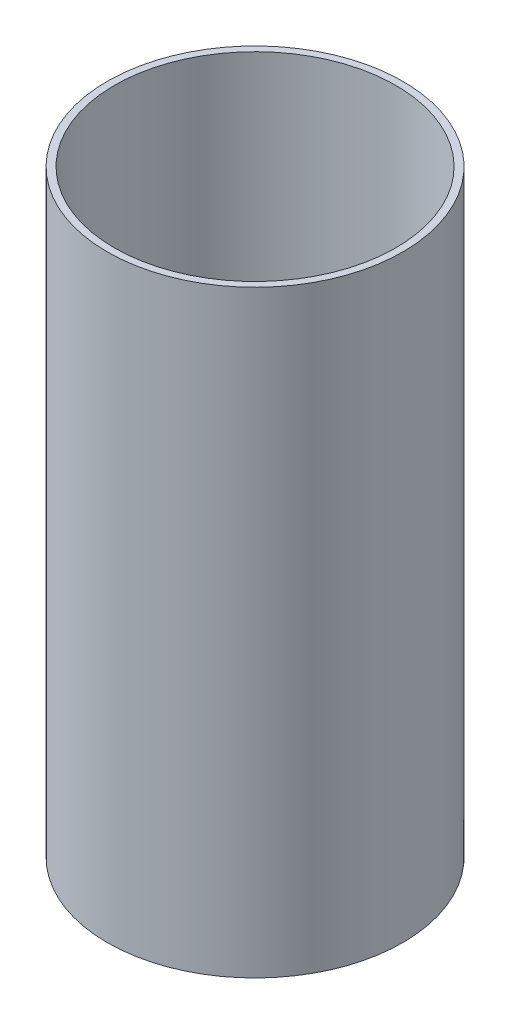
ISO-10303-21;
HEADER;
FILE_DESCRIPTION(('STEP AP214'),'2;1');
FILE_NAME('part.step','',(''),(''),'','','');
FILE_SCHEMA(('AUTOMOTIVE_DESIGN { 1 0 10303 214 1 1 1 1 }'));
ENDSEC;
DATA;
#1=APPLICATION_CONTEXT('core data for automotive mechanical design processes');
#2=APPLICATION_PROTOCOL_DEFINITION('international standard','automotive_design',2000,#1);
#3=PRODUCT_CONTEXT('',#1,'mechanical');
#4=PRODUCT('Part','Part','',(#3));
#5=PRODUCT_RELATED_PRODUCT_CATEGORY('part','',(#4));
#6=PRODUCT_DEFINITION_FORMATION('','',#4);
#7=PRODUCT_DEFINITION_CONTEXT('part definition',#1,'design');
#8=PRODUCT_DEFINITION('design','',#6,#7);
#9=PRODUCT_DEFINITION_SHAPE('','',#8);
#10=(LENGTH_UNIT() NAMED_UNIT(*) SI_UNIT(.MILLI.,.METRE.));
#11=(NAMED_UNIT(*) PLANE_ANGLE_UNIT() SI_UNIT($,.RADIAN.));
#12=(NAMED_UNIT(*) SI_UNIT($,.STERADIAN.) SOLID_ANGLE_UNIT());
#13=UNCERTAINTY_MEASURE_WITH_UNIT(LENGTH_MEASURE(1.E-05),#10,'distance_accuracy_value','');
#14=(GEOMETRIC_REPRESENTATION_CONTEXT(3) GLOBAL_UNCERTAINTY_ASSIGNED_CONTEXT((#13)) GLOBAL_UNIT_ASSIGNED_CONTEXT((#10,
#11,#12)) REPRESENTATION_CONTEXT('',''));
#15=CARTESIAN_POINT('',(0.,0.,0.));
#16=DIRECTION('',(0.,0.,1.));
#17=DIRECTION('',(1.,0.,0.));
#18=AXIS2_PLACEMENT_3D('',#15,#16,#17);
#19=CARTESIAN_POINT('',(0.,85.,0.));
#20=DIRECTION('',(0.,1.,0.));
#21=DIRECTION('',(0.,0.,1.));
#22=AXIS2_PLACEMENT_3D('',#19,#20,#21);
#23=PLANE('',#22);
#24=CARTESIAN_POINT('',(0.,85.,0.));
#25=DIRECTION('',(0.,1.,0.));
#26=DIRECTION('',(0.,0.,1.));
#27=AXIS2_PLACEMENT_3D('',#24,#25,#26);
#28=CIRCLE('',#27,21.);
#29=CARTESIAN_POINT('',(0.,85.,21.));
#30=VERTEX_POINT('',#29);
#31=EDGE_CURVE('E10',#30,#30,#28,.T.);
#32=ORIENTED_EDGE('',*,*,#31,.T.);
#33=EDGE_LOOP('',(#32));
#34=FACE_BOUND('',#33,.T.);
#35=CARTESIAN_POINT('',(0.,85.,0.));
#36=DIRECTION('',(0.,1.,0.));
#37=DIRECTION('',(0.,0.,1.));
#38=AXIS2_PLACEMENT_3D('',#35,#36,#37);
#39=CIRCLE('',#38,20.);
#40=CARTESIAN_POINT('',(0.,85.,20.));
#41=VERTEX_POINT('',#40);
#42=EDGE_CURVE('E47',#41,#41,#39,.T.);
#43=ORIENTED_EDGE('',*,*,#42,.F.);
#44=EDGE_LOOP('',(#43));
#45=FACE_BOUND('',#44,.T.);
#46=ADVANCED_FACE('F36',(#34,#45),#23,.T.);
#47=CARTESIAN_POINT('',(0.,0.,0.));
#48=DIRECTION('',(0.,1.,0.));
#49=DIRECTION('',(0.,0.,1.));
#50=AXIS2_PLACEMENT_3D('',#47,#48,#49);
#51=PLANE('',#50);
#52=CARTESIAN_POINT('',(0.,0.,0.));
#53=DIRECTION('',(0.,1.,0.));
#54=DIRECTION('',(0.,0.,1.));
#55=AXIS2_PLACEMENT_3D('',#52,#53,#54);
#56=CIRCLE('',#55,21.);
#57=CARTESIAN_POINT('',(0.,0.,21.));
#58=VERTEX_POINT('',#57);
#59=EDGE_CURVE('E40',#58,#58,#56,.T.);
#60=ORIENTED_EDGE('',*,*,#59,.F.);
#61=EDGE_LOOP('',(#60));
#62=FACE_BOUND('',#61,.T.);
#63=CARTESIAN_POINT('',(0.,0.,0.));
#64=DIRECTION('',(0.,1.,0.));
#65=DIRECTION('',(0.,0.,1.));
#66=AXIS2_PLACEMENT_3D('',#63,#64,#65);
#67=CIRCLE('',#66,20.);
#68=CARTESIAN_POINT('',(0.,0.,20.));
#69=VERTEX_POINT('',#68);
#70=EDGE_CURVE('E49',#69,#69,#67,.T.);
#71=ORIENTED_EDGE('',*,*,#70,.T.);
#72=EDGE_LOOP('',(#71));
#73=FACE_BOUND('',#72,.T.);
#74=ADVANCED_FACE('F59',(#62,#73),#51,.F.);
#75=CARTESIAN_POINT('',(0.,85.,0.));
#76=DIRECTION('',(0.,-1.,0.));
#77=DIRECTION('',(0.,0.,-1.));
#78=AXIS2_PLACEMENT_3D('',#75,#76,#77);
#79=CYLINDRICAL_SURFACE('',#78,21.);
#80=ORIENTED_EDGE('',*,*,#31,.F.);
#81=EDGE_LOOP('',(#80));
#82=FACE_BOUND('',#81,.T.);
#83=ORIENTED_EDGE('',*,*,#59,.T.);
#84=EDGE_LOOP('',(#83));
#85=FACE_BOUND('',#84,.T.);
#86=ADVANCED_FACE('F38',(#82,#85),#79,.T.);
#87=CARTESIAN_POINT('',(0.,85.,0.));
#88=DIRECTION('',(0.,-1.,0.));
#89=DIRECTION('',(0.,0.,-1.));
#90=AXIS2_PLACEMENT_3D('',#87,#88,#89);
#91=CYLINDRICAL_SURFACE('',#90,20.);
#92=ORIENTED_EDGE('',*,*,#42,.T.);
#93=EDGE_LOOP('',(#92));
#94=FACE_BOUND('',#93,.T.);
#95=ORIENTED_EDGE('',*,*,#70,.F.);
#96=EDGE_LOOP('',(#95));
#97=FACE_BOUND('',#96,.T.);
#98=ADVANCED_FACE('F55',(#94,#97),#91,.F.);
#99=CLOSED_SHELL('',(#46,#74,#86,#98));
#100=MANIFOLD_SOLID_BREP('B2',#99);
#101=ADVANCED_BREP_SHAPE_REPRESENTATION('',(#18,#100),#14);
#102=SHAPE_DEFINITION_REPRESENTATION(#9,#101);
ENDSEC;
END-ISO-10303-21;
